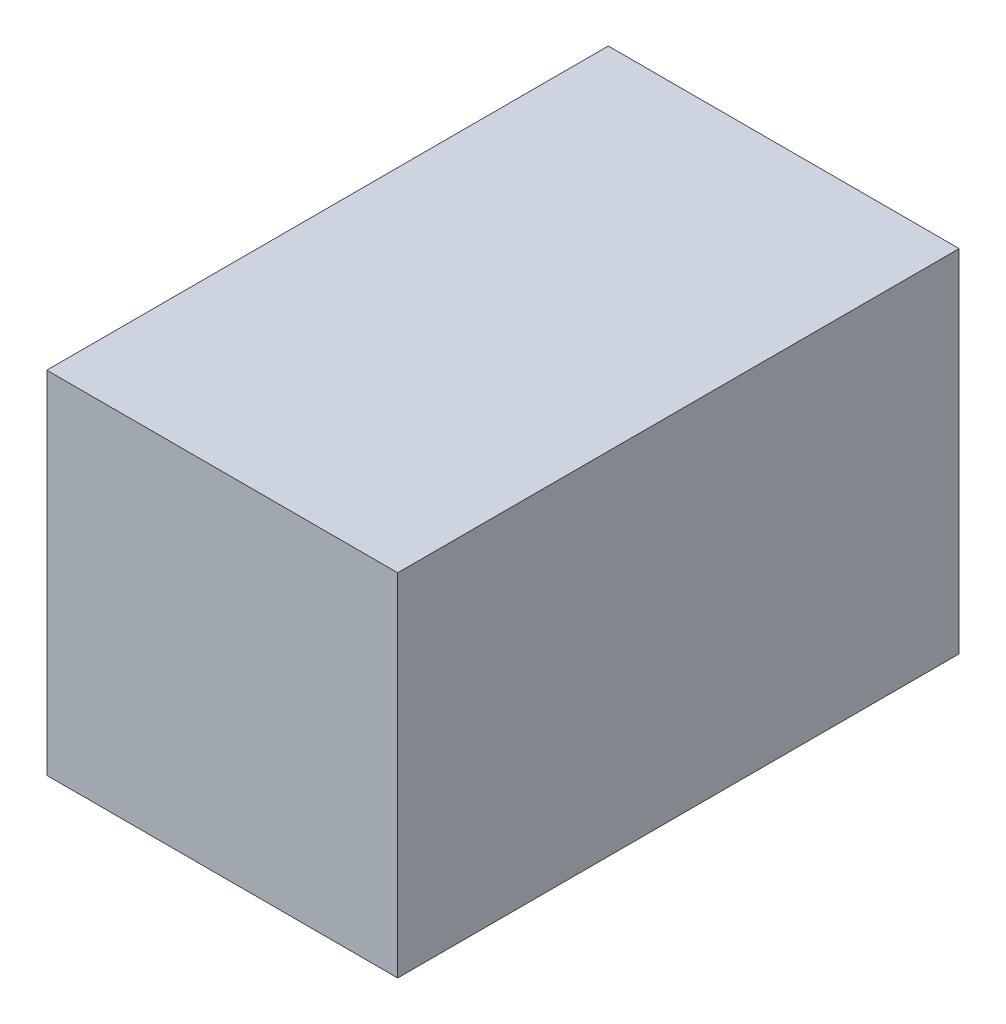
ISO-10303-21;
HEADER;
FILE_DESCRIPTION(('STEP AP214'),'2;1');
FILE_NAME('part.step','',(''),(''),'','','');
FILE_SCHEMA(('AUTOMOTIVE_DESIGN { 1 0 10303 214 1 1 1 1 }'));
ENDSEC;
DATA;
#1=APPLICATION_CONTEXT('core data for automotive mechanical design processes');
#2=APPLICATION_PROTOCOL_DEFINITION('international standard','automotive_design',2000,#1);
#3=PRODUCT_CONTEXT('',#1,'mechanical');
#4=PRODUCT('Part','Part','',(#3));
#5=PRODUCT_RELATED_PRODUCT_CATEGORY('part','',(#4));
#6=PRODUCT_DEFINITION_FORMATION('','',#4);
#7=PRODUCT_DEFINITION_CONTEXT('part definition',#1,'design');
#8=PRODUCT_DEFINITION('design','',#6,#7);
#9=PRODUCT_DEFINITION_SHAPE('','',#8);
#10=(LENGTH_UNIT() NAMED_UNIT(*) SI_UNIT(.MILLI.,.METRE.));
#11=(NAMED_UNIT(*) PLANE_ANGLE_UNIT() SI_UNIT($,.RADIAN.));
#12=(NAMED_UNIT(*) SI_UNIT($,.STERADIAN.) SOLID_ANGLE_UNIT());
#13=UNCERTAINTY_MEASURE_WITH_UNIT(LENGTH_MEASURE(1.E-05),#10,'distance_accuracy_value','');
#14=(GEOMETRIC_REPRESENTATION_CONTEXT(3) GLOBAL_UNCERTAINTY_ASSIGNED_CONTEXT((#13)) GLOBAL_UNIT_ASSIGNED_CONTEXT((#10,
#11,#12)) REPRESENTATION_CONTEXT('',''));
#15=CARTESIAN_POINT('',(0.,0.,0.));
#16=DIRECTION('',(0.,0.,1.));
#17=DIRECTION('',(1.,0.,0.));
#18=AXIS2_PLACEMENT_3D('',#15,#16,#17);
#19=CARTESIAN_POINT('',(-127.,-127.,406.4));
#20=DIRECTION('',(1.,0.,0.));
#21=DIRECTION('',(0.,0.,-1.));
#22=AXIS2_PLACEMENT_3D('',#19,#20,#21);
#23=PLANE('',#22);
#24=DIRECTION('',(0.,-1.,0.));
#25=VECTOR('',#24,1.);
#26=CARTESIAN_POINT('',(-127.,-127.,0.));
#27=LINE('',#26,#25);
#28=CARTESIAN_POINT('',(-127.,127.,0.));
#29=VERTEX_POINT('',#28);
#30=CARTESIAN_POINT('',(-127.,-127.,0.));
#31=VERTEX_POINT('',#30);
#32=EDGE_CURVE('E117',#29,#31,#27,.T.);
#33=ORIENTED_EDGE('',*,*,#32,.T.);
#34=DIRECTION('',(0.,0.,-1.));
#35=VECTOR('',#34,1.);
#36=CARTESIAN_POINT('',(-127.,-127.,406.4));
#37=LINE('',#36,#35);
#38=CARTESIAN_POINT('',(-127.,-127.,406.4));
#39=VERTEX_POINT('',#38);
#40=EDGE_CURVE('E11',#39,#31,#37,.T.);
#41=ORIENTED_EDGE('',*,*,#40,.F.);
#42=DIRECTION('',(0.,-1.,0.));
#43=VECTOR('',#42,1.);
#44=CARTESIAN_POINT('',(-127.,-127.,406.4));
#45=LINE('',#44,#43);
#46=CARTESIAN_POINT('',(-127.,127.,406.4));
#47=VERTEX_POINT('',#46);
#48=EDGE_CURVE('E101',#47,#39,#45,.T.);
#49=ORIENTED_EDGE('',*,*,#48,.F.);
#50=DIRECTION('',(0.,0.,-1.));
#51=VECTOR('',#50,1.);
#52=CARTESIAN_POINT('',(-127.,127.,406.4));
#53=LINE('',#52,#51);
#54=EDGE_CURVE('E113',#47,#29,#53,.T.);
#55=ORIENTED_EDGE('',*,*,#54,.T.);
#56=EDGE_LOOP('',(#33,#41,#49,#55));
#57=FACE_BOUND('',#56,.T.);
#58=ADVANCED_FACE('F49',(#57),#23,.F.);
#59=CARTESIAN_POINT('',(127.,-127.,406.4));
#60=DIRECTION('',(0.,1.,0.));
#61=DIRECTION('',(-1.,0.,0.));
#62=AXIS2_PLACEMENT_3D('',#59,#60,#61);
#63=PLANE('',#62);
#64=DIRECTION('',(1.,0.,0.));
#65=VECTOR('',#64,1.);
#66=CARTESIAN_POINT('',(127.,-127.,0.));
#67=LINE('',#66,#65);
#68=CARTESIAN_POINT('',(127.,-127.,0.));
#69=VERTEX_POINT('',#68);
#70=EDGE_CURVE('E106',#31,#69,#67,.T.);
#71=ORIENTED_EDGE('',*,*,#70,.T.);
#72=DIRECTION('',(0.,0.,-1.));
#73=VECTOR('',#72,1.);
#74=CARTESIAN_POINT('',(127.,-127.,406.4));
#75=LINE('',#74,#73);
#76=CARTESIAN_POINT('',(127.,-127.,406.4));
#77=VERTEX_POINT('',#76);
#78=EDGE_CURVE('E58',#77,#69,#75,.T.);
#79=ORIENTED_EDGE('',*,*,#78,.F.);
#80=DIRECTION('',(1.,0.,0.));
#81=VECTOR('',#80,1.);
#82=CARTESIAN_POINT('',(127.,-127.,406.4));
#83=LINE('',#82,#81);
#84=EDGE_CURVE('E96',#39,#77,#83,.T.);
#85=ORIENTED_EDGE('',*,*,#84,.F.);
#86=ORIENTED_EDGE('',*,*,#40,.T.);
#87=EDGE_LOOP('',(#71,#79,#85,#86));
#88=FACE_BOUND('',#87,.T.);
#89=ADVANCED_FACE('F105',(#88),#63,.F.);
#90=CARTESIAN_POINT('',(127.,-127.,406.4));
#91=DIRECTION('',(-1.,0.,0.));
#92=DIRECTION('',(0.,0.,1.));
#93=AXIS2_PLACEMENT_3D('',#90,#91,#92);
#94=PLANE('',#93);
#95=DIRECTION('',(0.,1.,0.));
#96=VECTOR('',#95,1.);
#97=CARTESIAN_POINT('',(127.,-127.,0.));
#98=LINE('',#97,#96);
#99=CARTESIAN_POINT('',(127.,127.,0.));
#100=VERTEX_POINT('',#99);
#101=EDGE_CURVE('E83',#69,#100,#98,.T.);
#102=ORIENTED_EDGE('',*,*,#101,.T.);
#103=DIRECTION('',(0.,0.,-1.));
#104=VECTOR('',#103,1.);
#105=CARTESIAN_POINT('',(127.,127.,406.4));
#106=LINE('',#105,#104);
#107=CARTESIAN_POINT('',(127.,127.,406.4));
#108=VERTEX_POINT('',#107);
#109=EDGE_CURVE('E108',#108,#100,#106,.T.);
#110=ORIENTED_EDGE('',*,*,#109,.F.);
#111=DIRECTION('',(0.,1.,0.));
#112=VECTOR('',#111,1.);
#113=CARTESIAN_POINT('',(127.,-127.,406.4));
#114=LINE('',#113,#112);
#115=EDGE_CURVE('E99',#77,#108,#114,.T.);
#116=ORIENTED_EDGE('',*,*,#115,.F.);
#117=ORIENTED_EDGE('',*,*,#78,.T.);
#118=EDGE_LOOP('',(#102,#110,#116,#117));
#119=FACE_BOUND('',#118,.T.);
#120=ADVANCED_FACE('F109',(#119),#94,.F.);
#121=CARTESIAN_POINT('',(127.,127.,406.4));
#122=DIRECTION('',(0.,-1.,0.));
#123=DIRECTION('',(1.,0.,0.));
#124=AXIS2_PLACEMENT_3D('',#121,#122,#123);
#125=PLANE('',#124);
#126=DIRECTION('',(-1.,0.,0.));
#127=VECTOR('',#126,1.);
#128=CARTESIAN_POINT('',(127.,127.,0.));
#129=LINE('',#128,#127);
#130=EDGE_CURVE('E89',#100,#29,#129,.T.);
#131=ORIENTED_EDGE('',*,*,#130,.T.);
#132=ORIENTED_EDGE('',*,*,#54,.F.);
#133=DIRECTION('',(-1.,0.,0.));
#134=VECTOR('',#133,1.);
#135=CARTESIAN_POINT('',(127.,127.,406.4));
#136=LINE('',#135,#134);
#137=EDGE_CURVE('E66',#108,#47,#136,.T.);
#138=ORIENTED_EDGE('',*,*,#137,.F.);
#139=ORIENTED_EDGE('',*,*,#109,.T.);
#140=EDGE_LOOP('',(#131,#132,#138,#139));
#141=FACE_BOUND('',#140,.T.);
#142=ADVANCED_FACE('F130',(#141),#125,.F.);
#143=CARTESIAN_POINT('',(0.,0.,406.4));
#144=DIRECTION('',(0.,0.,1.));
#145=DIRECTION('',(1.,0.,0.));
#146=AXIS2_PLACEMENT_3D('',#143,#144,#145);
#147=PLANE('',#146);
#148=ORIENTED_EDGE('',*,*,#48,.T.);
#149=ORIENTED_EDGE('',*,*,#84,.T.);
#150=ORIENTED_EDGE('',*,*,#115,.T.);
#151=ORIENTED_EDGE('',*,*,#137,.T.);
#152=EDGE_LOOP('',(#148,#149,#150,#151));
#153=FACE_BOUND('',#152,.T.);
#154=ADVANCED_FACE('F97',(#153),#147,.T.);
#155=CARTESIAN_POINT('',(0.,0.,0.));
#156=DIRECTION('',(0.,0.,1.));
#157=DIRECTION('',(1.,0.,0.));
#158=AXIS2_PLACEMENT_3D('',#155,#156,#157);
#159=PLANE('',#158);
#160=ORIENTED_EDGE('',*,*,#32,.F.);
#161=ORIENTED_EDGE('',*,*,#130,.F.);
#162=ORIENTED_EDGE('',*,*,#101,.F.);
#163=ORIENTED_EDGE('',*,*,#70,.F.);
#164=EDGE_LOOP('',(#160,#161,#162,#163));
#165=FACE_BOUND('',#164,.T.);
#166=ADVANCED_FACE('F133',(#165),#159,.F.);
#167=CLOSED_SHELL('',(#58,#89,#120,#142,#154,#166));
#168=MANIFOLD_SOLID_BREP('B2',#167);
#169=ADVANCED_BREP_SHAPE_REPRESENTATION('',(#18,#168),#14);
#170=SHAPE_DEFINITION_REPRESENTATION(#9,#169);
ENDSEC;
END-ISO-10303-21;
